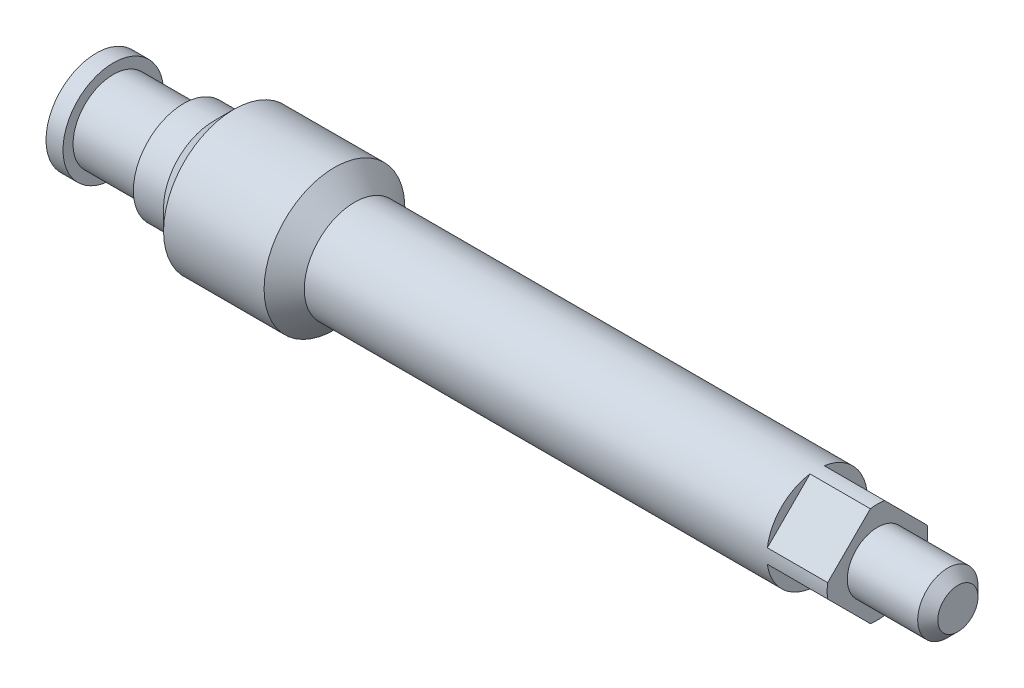
ISO-10303-21;
HEADER;
FILE_DESCRIPTION(('STEP AP214'),'2;1');
FILE_NAME('part.step','',(''),(''),'','','');
FILE_SCHEMA(('AUTOMOTIVE_DESIGN { 1 0 10303 214 1 1 1 1 }'));
ENDSEC;
DATA;
#1=APPLICATION_CONTEXT('core data for automotive mechanical design processes');
#2=APPLICATION_PROTOCOL_DEFINITION('international standard','automotive_design',2000,#1);
#3=PRODUCT_CONTEXT('',#1,'mechanical');
#4=PRODUCT('Part','Part','',(#3));
#5=PRODUCT_RELATED_PRODUCT_CATEGORY('part','',(#4));
#6=PRODUCT_DEFINITION_FORMATION('','',#4);
#7=PRODUCT_DEFINITION_CONTEXT('part definition',#1,'design');
#8=PRODUCT_DEFINITION('design','',#6,#7);
#9=PRODUCT_DEFINITION_SHAPE('','',#8);
#10=(LENGTH_UNIT() NAMED_UNIT(*) SI_UNIT(.MILLI.,.METRE.));
#11=(NAMED_UNIT(*) PLANE_ANGLE_UNIT() SI_UNIT($,.RADIAN.));
#12=(NAMED_UNIT(*) SI_UNIT($,.STERADIAN.) SOLID_ANGLE_UNIT());
#13=UNCERTAINTY_MEASURE_WITH_UNIT(LENGTH_MEASURE(1.E-05),#10,'distance_accuracy_value','');
#14=(GEOMETRIC_REPRESENTATION_CONTEXT(3) GLOBAL_UNCERTAINTY_ASSIGNED_CONTEXT((#13)) GLOBAL_UNIT_ASSIGNED_CONTEXT((#10,
#11,#12)) REPRESENTATION_CONTEXT('',''));
#15=CARTESIAN_POINT('',(0.,0.,0.));
#16=DIRECTION('',(0.,0.,1.));
#17=DIRECTION('',(1.,0.,0.));
#18=AXIS2_PLACEMENT_3D('',#15,#16,#17);
#19=CARTESIAN_POINT('',(79.,3.,0.));
#20=DIRECTION('',(-1.,0.,0.));
#21=DIRECTION('',(0.,0.,1.));
#22=AXIS2_PLACEMENT_3D('',#19,#20,#21);
#23=PLANE('',#22);
#24=CARTESIAN_POINT('',(79.,0.,0.));
#25=DIRECTION('',(-1.,0.,0.));
#26=DIRECTION('',(0.,0.,1.));
#27=AXIS2_PLACEMENT_3D('',#24,#25,#26);
#28=CIRCLE('',#27,3.);
#29=CARTESIAN_POINT('',(79.,0.,3.));
#30=VERTEX_POINT('',#29);
#31=EDGE_CURVE('E159',#30,#30,#28,.T.);
#32=ORIENTED_EDGE('',*,*,#31,.T.);
#33=EDGE_LOOP('',(#32));
#34=FACE_BOUND('',#33,.T.);
#35=DIRECTION('',(0.,-0.707106781186547,0.707106781186547));
#36=VECTOR('',#35,1.);
#37=CARTESIAN_POINT('',(79.,5.65685424949238,0.));
#38=LINE('',#37,#36);
#39=CARTESIAN_POINT('',(79.,4.94974746830583,0.707106781186552));
#40=VERTEX_POINT('',#39);
#41=CARTESIAN_POINT('',(79.,0.707106781186552,4.94974746830583));
#42=VERTEX_POINT('',#41);
#43=EDGE_CURVE('E129',#40,#42,#38,.T.);
#44=ORIENTED_EDGE('',*,*,#43,.T.);
#45=CARTESIAN_POINT('',(79.,0.,0.));
#46=DIRECTION('',(-1.,0.,0.));
#47=DIRECTION('',(0.,0.,1.));
#48=AXIS2_PLACEMENT_3D('',#45,#46,#47);
#49=CIRCLE('',#48,5.);
#50=CARTESIAN_POINT('',(79.,-0.707106781186551,4.94974746830583));
#51=VERTEX_POINT('',#50);
#52=EDGE_CURVE('E137',#51,#42,#49,.T.);
#53=ORIENTED_EDGE('',*,*,#52,.F.);
#54=DIRECTION('',(0.,-0.707106781186547,-0.707106781186547));
#55=VECTOR('',#54,1.);
#56=CARTESIAN_POINT('',(79.,0.,5.65685424949238));
#57=LINE('',#56,#55);
#58=CARTESIAN_POINT('',(79.,-4.94974746830583,0.707106781186552));
#59=VERTEX_POINT('',#58);
#60=EDGE_CURVE('E116',#51,#59,#57,.T.);
#61=ORIENTED_EDGE('',*,*,#60,.T.);
#62=CARTESIAN_POINT('',(79.,-4.94974746830583,-0.707106781186549));
#63=VERTEX_POINT('',#62);
#64=EDGE_CURVE('E146',#63,#59,#49,.T.);
#65=ORIENTED_EDGE('',*,*,#64,.F.);
#66=DIRECTION('',(0.,0.707106781186548,-0.707106781186547));
#67=VECTOR('',#66,1.);
#68=CARTESIAN_POINT('',(79.,0.,-5.65685424949238));
#69=LINE('',#68,#67);
#70=CARTESIAN_POINT('',(79.,-0.707106781186548,-4.94974746830583));
#71=VERTEX_POINT('',#70);
#72=EDGE_CURVE('E128',#63,#71,#69,.T.);
#73=ORIENTED_EDGE('',*,*,#72,.T.);
#74=CARTESIAN_POINT('',(79.,0.707106781186552,-4.94974746830583));
#75=VERTEX_POINT('',#74);
#76=EDGE_CURVE('E152',#75,#71,#49,.T.);
#77=ORIENTED_EDGE('',*,*,#76,.F.);
#78=DIRECTION('',(0.,0.707106781186547,0.707106781186547));
#79=VECTOR('',#78,1.);
#80=CARTESIAN_POINT('',(79.,5.65685424949238,0.));
#81=LINE('',#80,#79);
#82=CARTESIAN_POINT('',(79.,4.94974746830583,-0.707106781186551));
#83=VERTEX_POINT('',#82);
#84=EDGE_CURVE('E174',#75,#83,#81,.T.);
#85=ORIENTED_EDGE('',*,*,#84,.T.);
#86=EDGE_CURVE('E149',#40,#83,#49,.T.);
#87=ORIENTED_EDGE('',*,*,#86,.F.);
#88=EDGE_LOOP('',(#44,#53,#61,#65,#73,#77,#85,#87));
#89=FACE_BOUND('',#88,.T.);
#90=ADVANCED_FACE('F48',(#34,#89),#23,.F.);
#91=CARTESIAN_POINT('',(0.,0.,0.));
#92=DIRECTION('',(-1.,0.,0.));
#93=DIRECTION('',(0.,0.,1.));
#94=AXIS2_PLACEMENT_3D('',#91,#92,#93);
#95=CYLINDRICAL_SURFACE('',#94,5.);
#96=CARTESIAN_POINT('',(27.,0.,0.));
#97=DIRECTION('',(-1.,0.,0.));
#98=DIRECTION('',(0.,0.,1.));
#99=AXIS2_PLACEMENT_3D('',#96,#97,#98);
#100=CIRCLE('',#99,5.);
#101=CARTESIAN_POINT('',(27.,0.,5.));
#102=VERTEX_POINT('',#101);
#103=EDGE_CURVE('E332',#102,#102,#100,.F.);
#104=ORIENTED_EDGE('',*,*,#103,.T.);
#105=EDGE_LOOP('',(#104));
#106=FACE_BOUND('',#105,.T.);
#107=DIRECTION('',(-1.,0.,0.));
#108=VECTOR('',#107,1.);
#109=CARTESIAN_POINT('',(0.,4.94974746830583,0.707106781186552));
#110=LINE('',#109,#108);
#111=CARTESIAN_POINT('',(73.,4.94974746830583,0.707106781186552));
#112=VERTEX_POINT('',#111);
#113=EDGE_CURVE('E12',#40,#112,#110,.T.);
#114=ORIENTED_EDGE('',*,*,#113,.F.);
#115=ORIENTED_EDGE('',*,*,#86,.T.);
#116=DIRECTION('',(-1.,0.,0.));
#117=VECTOR('',#116,1.);
#118=CARTESIAN_POINT('',(0.,4.94974746830583,-0.707106781186552));
#119=LINE('',#118,#117);
#120=CARTESIAN_POINT('',(73.,4.94974746830583,-0.707106781186552));
#121=VERTEX_POINT('',#120);
#122=EDGE_CURVE('E315',#121,#83,#119,.F.);
#123=ORIENTED_EDGE('',*,*,#122,.F.);
#124=CARTESIAN_POINT('',(73.,0.,0.));
#125=DIRECTION('',(1.,0.,0.));
#126=DIRECTION('',(0.,0.,-1.));
#127=AXIS2_PLACEMENT_3D('',#124,#125,#126);
#128=CIRCLE('',#127,5.);
#129=CARTESIAN_POINT('',(73.,0.707106781186552,-4.94974746830583));
#130=VERTEX_POINT('',#129);
#131=EDGE_CURVE('E310',#130,#121,#128,.T.);
#132=ORIENTED_EDGE('',*,*,#131,.F.);
#133=DIRECTION('',(-1.,0.,0.));
#134=VECTOR('',#133,1.);
#135=CARTESIAN_POINT('',(0.,0.707106781186552,-4.94974746830583));
#136=LINE('',#135,#134);
#137=EDGE_CURVE('E171',#75,#130,#136,.T.);
#138=ORIENTED_EDGE('',*,*,#137,.F.);
#139=ORIENTED_EDGE('',*,*,#76,.T.);
#140=DIRECTION('',(-1.,0.,0.));
#141=VECTOR('',#140,1.);
#142=CARTESIAN_POINT('',(0.,-0.707106781186548,-4.94974746830583));
#143=LINE('',#142,#141);
#144=CARTESIAN_POINT('',(73.,-0.707106781186548,-4.94974746830583));
#145=VERTEX_POINT('',#144);
#146=EDGE_CURVE('E141',#145,#71,#143,.F.);
#147=ORIENTED_EDGE('',*,*,#146,.F.);
#148=CARTESIAN_POINT('',(73.,-4.94974746830583,-0.707106781186549));
#149=VERTEX_POINT('',#148);
#150=EDGE_CURVE('E318',#149,#145,#128,.T.);
#151=ORIENTED_EDGE('',*,*,#150,.F.);
#152=DIRECTION('',(-1.,0.,0.));
#153=VECTOR('',#152,1.);
#154=CARTESIAN_POINT('',(0.,-4.94974746830583,-0.707106781186549));
#155=LINE('',#154,#153);
#156=EDGE_CURVE('E320',#63,#149,#155,.T.);
#157=ORIENTED_EDGE('',*,*,#156,.F.);
#158=ORIENTED_EDGE('',*,*,#64,.T.);
#159=DIRECTION('',(-1.,0.,0.));
#160=VECTOR('',#159,1.);
#161=CARTESIAN_POINT('',(0.,-4.94974746830583,0.707106781186552));
#162=LINE('',#161,#160);
#163=CARTESIAN_POINT('',(73.,-4.94974746830583,0.707106781186552));
#164=VERTEX_POINT('',#163);
#165=EDGE_CURVE('E122',#164,#59,#162,.F.);
#166=ORIENTED_EDGE('',*,*,#165,.F.);
#167=CARTESIAN_POINT('',(73.,-0.707106781186551,4.94974746830583));
#168=VERTEX_POINT('',#167);
#169=EDGE_CURVE('E139',#168,#164,#128,.T.);
#170=ORIENTED_EDGE('',*,*,#169,.F.);
#171=DIRECTION('',(-1.,0.,0.));
#172=VECTOR('',#171,1.);
#173=CARTESIAN_POINT('',(0.,-0.707106781186552,4.94974746830583));
#174=LINE('',#173,#172);
#175=EDGE_CURVE('E119',#51,#168,#174,.T.);
#176=ORIENTED_EDGE('',*,*,#175,.F.);
#177=ORIENTED_EDGE('',*,*,#52,.T.);
#178=DIRECTION('',(-1.,0.,0.));
#179=VECTOR('',#178,1.);
#180=CARTESIAN_POINT('',(0.,0.707106781186552,4.94974746830583));
#181=LINE('',#180,#179);
#182=CARTESIAN_POINT('',(73.,0.707106781186552,4.94974746830583));
#183=VERTEX_POINT('',#182);
#184=EDGE_CURVE('E309',#183,#42,#181,.F.);
#185=ORIENTED_EDGE('',*,*,#184,.F.);
#186=EDGE_CURVE('E58',#112,#183,#128,.T.);
#187=ORIENTED_EDGE('',*,*,#186,.F.);
#188=EDGE_LOOP('',(#114,#115,#123,#132,#138,#139,#147,#151,#157,#158,#166,#170,#176,#177,#185,#187));
#189=FACE_BOUND('',#188,.T.);
#190=ADVANCED_FACE('F135',(#106,#189),#95,.T.);
#191=CARTESIAN_POINT('',(11.9907331097935,0.,-0.471507677245316));
#192=DIRECTION('',(0.,-1.,0.));
#193=DIRECTION('',(0.,0.,1.));
#194=AXIS2_PLACEMENT_3D('',#191,#192,#193);
#195=CIRCLE('',#194,12.);
#196=TRIMMED_CURVE('',#195,(PARAMETER_VALUE(-1.53149390285775)),
(PARAMETER_VALUE(1.53149390285775)),.T.,.PARAMETER.);
#197=CARTESIAN_POINT('',(11.9907331097935,0.,0.));
#198=DIRECTION('',(-1.,0.,0.));
#199=AXIS1_PLACEMENT('',#197,#198);
#200=SURFACE_OF_REVOLUTION('',#196,#199);
#201=CARTESIAN_POINT('',(0.,0.,0.));
#202=VERTEX_POINT('',#201);
#203=VERTEX_LOOP('',#202);
#204=FACE_BOUND('',#203,.T.);
#205=CARTESIAN_POINT('',(1.31072357150913,0.,0.));
#206=DIRECTION('',(-1.,0.,0.));
#207=DIRECTION('',(0.,0.,1.));
#208=AXIS2_PLACEMENT_3D('',#205,#206,#207);
#209=CIRCLE('',#208,4.99999999999999);
#210=CARTESIAN_POINT('',(1.31072357150913,0.,4.99999999999999));
#211=VERTEX_POINT('',#210);
#212=EDGE_CURVE('E183',#211,#211,#209,.T.);
#213=ORIENTED_EDGE('',*,*,#212,.T.);
#214=EDGE_LOOP('',(#213));
#215=FACE_BOUND('',#214,.T.);
#216=ADVANCED_FACE('F229',(#204,#215),#200,.T.);
#217=CARTESIAN_POINT('',(87.,0.,0.));
#218=DIRECTION('',(-1.,0.,0.));
#219=DIRECTION('',(0.,0.,1.));
#220=AXIS2_PLACEMENT_3D('',#217,#218,#219);
#221=PLANE('',#220);
#222=CARTESIAN_POINT('',(87.,0.,0.));
#223=DIRECTION('',(-1.,0.,0.));
#224=DIRECTION('',(0.,0.,1.));
#225=AXIS2_PLACEMENT_3D('',#222,#223,#224);
#226=CIRCLE('',#225,2.00000000000003);
#227=CARTESIAN_POINT('',(87.,0.,2.00000000000003));
#228=VERTEX_POINT('',#227);
#229=EDGE_CURVE('E341',#228,#228,#226,.F.);
#230=ORIENTED_EDGE('',*,*,#229,.T.);
#231=EDGE_LOOP('',(#230));
#232=FACE_BOUND('',#231,.T.);
#233=ADVANCED_FACE('F238',(#232),#221,.F.);
#234=CARTESIAN_POINT('',(0.,0.,0.));
#235=DIRECTION('',(-1.,0.,0.));
#236=DIRECTION('',(0.,0.,1.));
#237=AXIS2_PLACEMENT_3D('',#234,#235,#236);
#238=CYLINDRICAL_SURFACE('',#237,3.);
#239=CARTESIAN_POINT('',(86.,0.,0.));
#240=DIRECTION('',(-1.,0.,0.));
#241=DIRECTION('',(0.,0.,1.));
#242=AXIS2_PLACEMENT_3D('',#239,#240,#241);
#243=CIRCLE('',#242,3.);
#244=CARTESIAN_POINT('',(86.,0.,3.));
#245=VERTEX_POINT('',#244);
#246=EDGE_CURVE('E164',#245,#245,#243,.T.);
#247=ORIENTED_EDGE('',*,*,#246,.T.);
#248=EDGE_LOOP('',(#247));
#249=FACE_BOUND('',#248,.T.);
#250=ORIENTED_EDGE('',*,*,#31,.F.);
#251=EDGE_LOOP('',(#250));
#252=FACE_BOUND('',#251,.T.);
#253=ADVANCED_FACE('F234',(#249,#252),#238,.T.);
#254=CARTESIAN_POINT('',(0.,0.,0.));
#255=DIRECTION('',(-1.,0.,0.));
#256=DIRECTION('',(0.,0.,1.));
#257=AXIS2_PLACEMENT_3D('',#254,#255,#256);
#258=CYLINDRICAL_SURFACE('',#257,7.);
#259=CARTESIAN_POINT('',(15.,0.,0.));
#260=DIRECTION('',(1.,0.,0.));
#261=DIRECTION('',(0.,0.,-1.));
#262=AXIS2_PLACEMENT_3D('',#259,#260,#261);
#263=CIRCLE('',#262,7.);
#264=CARTESIAN_POINT('',(15.,0.,-7.));
#265=VERTEX_POINT('',#264);
#266=EDGE_CURVE('E335',#265,#265,#263,.T.);
#267=ORIENTED_EDGE('',*,*,#266,.T.);
#268=EDGE_LOOP('',(#267));
#269=FACE_BOUND('',#268,.T.);
#270=CARTESIAN_POINT('',(25.,0.,0.));
#271=DIRECTION('',(-1.,0.,0.));
#272=DIRECTION('',(0.,0.,1.));
#273=AXIS2_PLACEMENT_3D('',#270,#271,#272);
#274=CIRCLE('',#273,7.);
#275=CARTESIAN_POINT('',(25.,0.,7.));
#276=VERTEX_POINT('',#275);
#277=EDGE_CURVE('E147',#276,#276,#274,.T.);
#278=ORIENTED_EDGE('',*,*,#277,.T.);
#279=EDGE_LOOP('',(#278));
#280=FACE_BOUND('',#279,.T.);
#281=ADVANCED_FACE('F237',(#269,#280),#258,.T.);
#282=CARTESIAN_POINT('',(0.,0.,0.));
#283=DIRECTION('',(-1.,0.,0.));
#284=DIRECTION('',(0.,0.,1.));
#285=AXIS2_PLACEMENT_3D('',#282,#283,#284);
#286=CYLINDRICAL_SURFACE('',#285,4.99999999999999);
#287=CARTESIAN_POINT('',(10.,0.,0.));
#288=DIRECTION('',(-1.,0.,0.));
#289=DIRECTION('',(0.,0.,1.));
#290=AXIS2_PLACEMENT_3D('',#287,#288,#289);
#291=CIRCLE('',#290,4.99999999999999);
#292=CARTESIAN_POINT('',(10.,0.,4.99999999999999));
#293=VERTEX_POINT('',#292);
#294=EDGE_CURVE('E199',#293,#293,#291,.T.);
#295=ORIENTED_EDGE('',*,*,#294,.F.);
#296=EDGE_LOOP('',(#295));
#297=FACE_BOUND('',#296,.T.);
#298=CARTESIAN_POINT('',(13.,0.,0.));
#299=DIRECTION('',(-1.,0.,0.));
#300=DIRECTION('',(0.,0.,1.));
#301=AXIS2_PLACEMENT_3D('',#298,#299,#300);
#302=CIRCLE('',#301,4.99999999999999);
#303=CARTESIAN_POINT('',(13.,0.,4.99999999999999));
#304=VERTEX_POINT('',#303);
#305=EDGE_CURVE('E154',#304,#304,#302,.T.);
#306=ORIENTED_EDGE('',*,*,#305,.T.);
#307=EDGE_LOOP('',(#306));
#308=FACE_BOUND('',#307,.T.);
#309=ADVANCED_FACE('F207',(#297,#308),#286,.T.);
#310=CARTESIAN_POINT('',(10.,4.99999999999999,0.));
#311=DIRECTION('',(1.,0.,0.));
#312=DIRECTION('',(0.,0.,-1.));
#313=AXIS2_PLACEMENT_3D('',#310,#311,#312);
#314=PLANE('',#313);
#315=CARTESIAN_POINT('',(10.,0.,0.));
#316=DIRECTION('',(-1.,0.,0.));
#317=DIRECTION('',(0.,0.,1.));
#318=AXIS2_PLACEMENT_3D('',#315,#316,#317);
#319=CIRCLE('',#318,4.);
#320=CARTESIAN_POINT('',(10.,0.,4.));
#321=VERTEX_POINT('',#320);
#322=EDGE_CURVE('E195',#321,#321,#319,.T.);
#323=ORIENTED_EDGE('',*,*,#322,.F.);
#324=EDGE_LOOP('',(#323));
#325=FACE_BOUND('',#324,.T.);
#326=ORIENTED_EDGE('',*,*,#294,.T.);
#327=EDGE_LOOP('',(#326));
#328=FACE_BOUND('',#327,.T.);
#329=ADVANCED_FACE('F271',(#325,#328),#314,.F.);
#330=CARTESIAN_POINT('',(0.,0.,0.));
#331=DIRECTION('',(-1.,0.,0.));
#332=DIRECTION('',(0.,0.,1.));
#333=AXIS2_PLACEMENT_3D('',#330,#331,#332);
#334=CYLINDRICAL_SURFACE('',#333,4.);
#335=CARTESIAN_POINT('',(3.,0.,0.));
#336=DIRECTION('',(-1.,0.,0.));
#337=DIRECTION('',(0.,0.,1.));
#338=AXIS2_PLACEMENT_3D('',#335,#336,#337);
#339=CIRCLE('',#338,4.);
#340=CARTESIAN_POINT('',(3.,0.,4.));
#341=VERTEX_POINT('',#340);
#342=EDGE_CURVE('E191',#341,#341,#339,.T.);
#343=ORIENTED_EDGE('',*,*,#342,.F.);
#344=EDGE_LOOP('',(#343));
#345=FACE_BOUND('',#344,.T.);
#346=ORIENTED_EDGE('',*,*,#322,.T.);
#347=EDGE_LOOP('',(#346));
#348=FACE_BOUND('',#347,.T.);
#349=ADVANCED_FACE('F265',(#345,#348),#334,.T.);
#350=CARTESIAN_POINT('',(3.,4.,0.));
#351=DIRECTION('',(-1.,0.,0.));
#352=DIRECTION('',(0.,0.,1.));
#353=AXIS2_PLACEMENT_3D('',#350,#351,#352);
#354=PLANE('',#353);
#355=CARTESIAN_POINT('',(3.,0.,0.));
#356=DIRECTION('',(-1.,0.,0.));
#357=DIRECTION('',(0.,0.,1.));
#358=AXIS2_PLACEMENT_3D('',#355,#356,#357);
#359=CIRCLE('',#358,4.99999999999999);
#360=CARTESIAN_POINT('',(3.,0.,4.99999999999999));
#361=VERTEX_POINT('',#360);
#362=EDGE_CURVE('E187',#361,#361,#359,.T.);
#363=ORIENTED_EDGE('',*,*,#362,.F.);
#364=EDGE_LOOP('',(#363));
#365=FACE_BOUND('',#364,.T.);
#366=ORIENTED_EDGE('',*,*,#342,.T.);
#367=EDGE_LOOP('',(#366));
#368=FACE_BOUND('',#367,.T.);
#369=ADVANCED_FACE('F259',(#365,#368),#354,.F.);
#370=CARTESIAN_POINT('',(0.,0.,0.));
#371=DIRECTION('',(-1.,0.,0.));
#372=DIRECTION('',(0.,0.,1.));
#373=AXIS2_PLACEMENT_3D('',#370,#371,#372);
#374=CYLINDRICAL_SURFACE('',#373,4.99999999999999);
#375=ORIENTED_EDGE('',*,*,#212,.F.);
#376=EDGE_LOOP('',(#375));
#377=FACE_BOUND('',#376,.T.);
#378=ORIENTED_EDGE('',*,*,#362,.T.);
#379=EDGE_LOOP('',(#378));
#380=FACE_BOUND('',#379,.T.);
#381=ADVANCED_FACE('F218',(#377,#380),#374,.T.);
#382=CARTESIAN_POINT('',(86.,0.,0.));
#383=DIRECTION('',(-1.,0.,0.));
#384=DIRECTION('',(0.,0.,1.));
#385=AXIS2_PLACEMENT_3D('',#382,#383,#384);
#386=CONICAL_SURFACE('',#385,3.,0.78539816339744);
#387=ORIENTED_EDGE('',*,*,#229,.F.);
#388=EDGE_LOOP('',(#387));
#389=FACE_BOUND('',#388,.T.);
#390=ORIENTED_EDGE('',*,*,#246,.F.);
#391=EDGE_LOOP('',(#390));
#392=FACE_BOUND('',#391,.T.);
#393=ADVANCED_FACE('F211',(#389,#392),#386,.T.);
#394=CARTESIAN_POINT('',(13.,0.,0.));
#395=DIRECTION('',(1.,0.,0.));
#396=DIRECTION('',(0.,0.,-1.));
#397=AXIS2_PLACEMENT_3D('',#394,#395,#396);
#398=CONICAL_SURFACE('',#397,4.99999999999999,0.785398163397449);
#399=ORIENTED_EDGE('',*,*,#266,.F.);
#400=EDGE_LOOP('',(#399));
#401=FACE_BOUND('',#400,.T.);
#402=ORIENTED_EDGE('',*,*,#305,.F.);
#403=EDGE_LOOP('',(#402));
#404=FACE_BOUND('',#403,.T.);
#405=ADVANCED_FACE('F209',(#401,#404),#398,.T.);
#406=CARTESIAN_POINT('',(25.,0.,0.));
#407=DIRECTION('',(-1.,0.,0.));
#408=DIRECTION('',(0.,0.,1.));
#409=AXIS2_PLACEMENT_3D('',#406,#407,#408);
#410=CONICAL_SURFACE('',#409,7.00000000000001,0.785398163397451);
#411=ORIENTED_EDGE('',*,*,#103,.F.);
#412=EDGE_LOOP('',(#411));
#413=FACE_BOUND('',#412,.T.);
#414=ORIENTED_EDGE('',*,*,#277,.F.);
#415=EDGE_LOOP('',(#414));
#416=FACE_BOUND('',#415,.T.);
#417=ADVANCED_FACE('F51',(#413,#416),#410,.T.);
#418=CARTESIAN_POINT('',(73.,0.,5.65685424949238));
#419=DIRECTION('',(0.,-0.707106781186548,0.707106781186548));
#420=DIRECTION('',(0.,-0.707106781186548,-0.707106781186548));
#421=AXIS2_PLACEMENT_3D('',#418,#419,#420);
#422=PLANE('',#421);
#423=ORIENTED_EDGE('',*,*,#175,.T.);
#424=DIRECTION('',(0.,-0.707106781186547,-0.707106781186547));
#425=VECTOR('',#424,1.);
#426=CARTESIAN_POINT('',(73.,0.,5.65685424949238));
#427=LINE('',#426,#425);
#428=EDGE_CURVE('E356',#168,#164,#427,.T.);
#429=ORIENTED_EDGE('',*,*,#428,.T.);
#430=ORIENTED_EDGE('',*,*,#165,.T.);
#431=ORIENTED_EDGE('',*,*,#60,.F.);
#432=EDGE_LOOP('',(#423,#429,#430,#431));
#433=FACE_BOUND('',#432,.T.);
#434=ADVANCED_FACE('F118',(#433),#422,.T.);
#435=CARTESIAN_POINT('',(73.,0.,0.));
#436=DIRECTION('',(1.,0.,0.));
#437=DIRECTION('',(0.,0.,-1.));
#438=AXIS2_PLACEMENT_3D('',#435,#436,#437);
#439=PLANE('',#438);
#440=ORIENTED_EDGE('',*,*,#169,.T.);
#441=ORIENTED_EDGE('',*,*,#428,.F.);
#442=EDGE_LOOP('',(#440,#441));
#443=FACE_BOUND('',#442,.T.);
#444=ADVANCED_FACE('F299',(#443),#439,.T.);
#445=CARTESIAN_POINT('',(73.,0.,-5.65685424949238));
#446=DIRECTION('',(0.,-0.707106781186547,-0.707106781186548));
#447=DIRECTION('',(0.,0.707106781186548,-0.707106781186547));
#448=AXIS2_PLACEMENT_3D('',#445,#446,#447);
#449=PLANE('',#448);
#450=ORIENTED_EDGE('',*,*,#156,.T.);
#451=DIRECTION('',(0.,0.707106781186548,-0.707106781186547));
#452=VECTOR('',#451,1.);
#453=CARTESIAN_POINT('',(73.,0.,-5.65685424949238));
#454=LINE('',#453,#452);
#455=EDGE_CURVE('E313',#149,#145,#454,.T.);
#456=ORIENTED_EDGE('',*,*,#455,.T.);
#457=ORIENTED_EDGE('',*,*,#146,.T.);
#458=ORIENTED_EDGE('',*,*,#72,.F.);
#459=EDGE_LOOP('',(#450,#456,#457,#458));
#460=FACE_BOUND('',#459,.T.);
#461=ADVANCED_FACE('F300',(#460),#449,.T.);
#462=ORIENTED_EDGE('',*,*,#150,.T.);
#463=ORIENTED_EDGE('',*,*,#455,.F.);
#464=EDGE_LOOP('',(#462,#463));
#465=FACE_BOUND('',#464,.T.);
#466=ADVANCED_FACE('F293',(#465),#439,.T.);
#467=CARTESIAN_POINT('',(73.,5.65685424949238,0.));
#468=DIRECTION('',(0.,0.707106781186548,-0.707106781186548));
#469=DIRECTION('',(0.,0.707106781186548,0.707106781186548));
#470=AXIS2_PLACEMENT_3D('',#467,#468,#469);
#471=PLANE('',#470);
#472=ORIENTED_EDGE('',*,*,#137,.T.);
#473=DIRECTION('',(0.,0.707106781186547,0.707106781186547));
#474=VECTOR('',#473,1.);
#475=CARTESIAN_POINT('',(73.,5.65685424949238,0.));
#476=LINE('',#475,#474);
#477=EDGE_CURVE('E72',#130,#121,#476,.T.);
#478=ORIENTED_EDGE('',*,*,#477,.T.);
#479=ORIENTED_EDGE('',*,*,#122,.T.);
#480=ORIENTED_EDGE('',*,*,#84,.F.);
#481=EDGE_LOOP('',(#472,#478,#479,#480));
#482=FACE_BOUND('',#481,.T.);
#483=ADVANCED_FACE('F291',(#482),#471,.T.);
#484=ORIENTED_EDGE('',*,*,#131,.T.);
#485=ORIENTED_EDGE('',*,*,#477,.F.);
#486=EDGE_LOOP('',(#484,#485));
#487=FACE_BOUND('',#486,.T.);
#488=ADVANCED_FACE('F287',(#487),#439,.T.);
#489=ORIENTED_EDGE('',*,*,#186,.T.);
#490=DIRECTION('',(0.,-0.707106781186547,0.707106781186547));
#491=VECTOR('',#490,1.);
#492=CARTESIAN_POINT('',(73.,5.65685424949238,0.));
#493=LINE('',#492,#491);
#494=EDGE_CURVE('E64',#112,#183,#493,.T.);
#495=ORIENTED_EDGE('',*,*,#494,.F.);
#496=EDGE_LOOP('',(#489,#495));
#497=FACE_BOUND('',#496,.T.);
#498=ADVANCED_FACE('F290',(#497),#439,.T.);
#499=CARTESIAN_POINT('',(73.,5.65685424949238,0.));
#500=DIRECTION('',(0.,0.707106781186548,0.707106781186548));
#501=DIRECTION('',(0.,-0.707106781186548,0.707106781186548));
#502=AXIS2_PLACEMENT_3D('',#499,#500,#501);
#503=PLANE('',#502);
#504=ORIENTED_EDGE('',*,*,#113,.T.);
#505=ORIENTED_EDGE('',*,*,#494,.T.);
#506=ORIENTED_EDGE('',*,*,#184,.T.);
#507=ORIENTED_EDGE('',*,*,#43,.F.);
#508=EDGE_LOOP('',(#504,#505,#506,#507));
#509=FACE_BOUND('',#508,.T.);
#510=ADVANCED_FACE('F294',(#509),#503,.T.);
#511=CLOSED_SHELL('',(#90,#190,#216,#233,#253,#281,#309,#329,#349,#369,#381,#393,#405,#417,#434,
#444,#461,#466,#483,#488,#498,#510));
#512=MANIFOLD_SOLID_BREP('B2',#511);
#513=ADVANCED_BREP_SHAPE_REPRESENTATION('',(#18,#512),#14);
#514=SHAPE_DEFINITION_REPRESENTATION(#9,#513);
ENDSEC;
END-ISO-10303-21;
